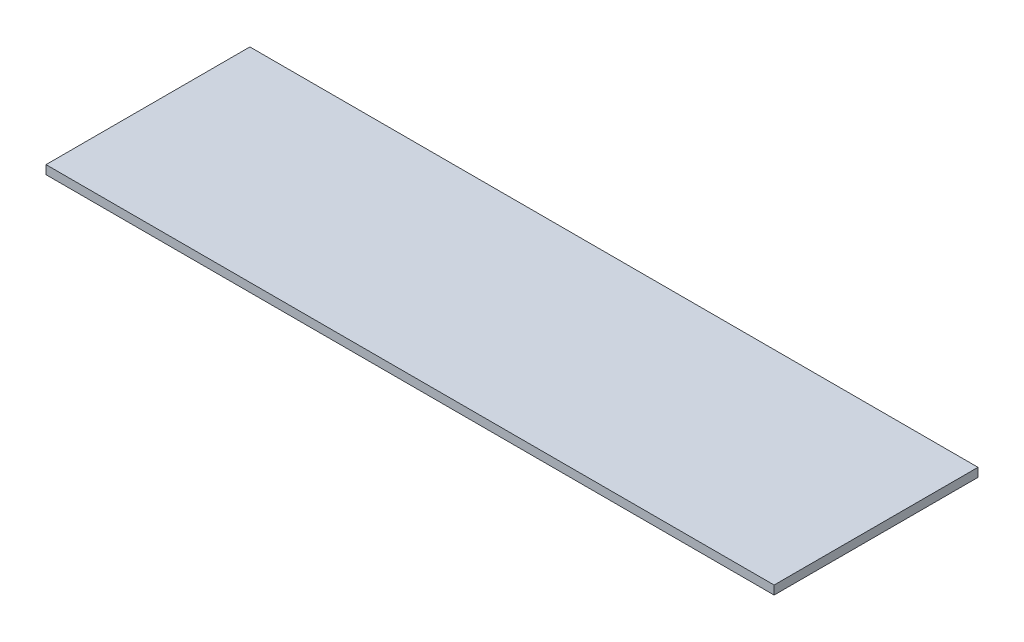
ISO-10303-21;
HEADER;
FILE_DESCRIPTION(('STEP AP214'),'2;1');
FILE_NAME('part.step','',(''),(''),'','','');
FILE_SCHEMA(('AUTOMOTIVE_DESIGN { 1 0 10303 214 1 1 1 1 }'));
ENDSEC;
DATA;
#1=APPLICATION_CONTEXT('core data for automotive mechanical design processes');
#2=APPLICATION_PROTOCOL_DEFINITION('international standard','automotive_design',2000,#1);
#3=PRODUCT_CONTEXT('',#1,'mechanical');
#4=PRODUCT('Part','Part','',(#3));
#5=PRODUCT_RELATED_PRODUCT_CATEGORY('part','',(#4));
#6=PRODUCT_DEFINITION_FORMATION('','',#4);
#7=PRODUCT_DEFINITION_CONTEXT('part definition',#1,'design');
#8=PRODUCT_DEFINITION('design','',#6,#7);
#9=PRODUCT_DEFINITION_SHAPE('','',#8);
#10=(LENGTH_UNIT() NAMED_UNIT(*) SI_UNIT(.MILLI.,.METRE.));
#11=(NAMED_UNIT(*) PLANE_ANGLE_UNIT() SI_UNIT($,.RADIAN.));
#12=(NAMED_UNIT(*) SI_UNIT($,.STERADIAN.) SOLID_ANGLE_UNIT());
#13=UNCERTAINTY_MEASURE_WITH_UNIT(LENGTH_MEASURE(1.E-05),#10,'distance_accuracy_value','');
#14=(GEOMETRIC_REPRESENTATION_CONTEXT(3) GLOBAL_UNCERTAINTY_ASSIGNED_CONTEXT((#13)) GLOBAL_UNIT_ASSIGNED_CONTEXT((#10,
#11,#12)) REPRESENTATION_CONTEXT('',''));
#15=CARTESIAN_POINT('',(0.,0.,0.));
#16=DIRECTION('',(0.,0.,1.));
#17=DIRECTION('',(1.,0.,0.));
#18=AXIS2_PLACEMENT_3D('',#15,#16,#17);
#19=CARTESIAN_POINT('',(125.,3.,35.));
#20=DIRECTION('',(-1.,0.,0.));
#21=DIRECTION('',(0.,0.,1.));
#22=AXIS2_PLACEMENT_3D('',#19,#20,#21);
#23=PLANE('',#22);
#24=DIRECTION('',(0.,0.,-1.));
#25=VECTOR('',#24,1.);
#26=CARTESIAN_POINT('',(125.,0.,35.));
#27=LINE('',#26,#25);
#28=CARTESIAN_POINT('',(125.,0.,35.));
#29=VERTEX_POINT('',#28);
#30=CARTESIAN_POINT('',(125.,0.,-35.));
#31=VERTEX_POINT('',#30);
#32=EDGE_CURVE('E111',#29,#31,#27,.T.);
#33=ORIENTED_EDGE('',*,*,#32,.T.);
#34=DIRECTION('',(0.,-1.,0.));
#35=VECTOR('',#34,1.);
#36=CARTESIAN_POINT('',(125.,3.,-35.));
#37=LINE('',#36,#35);
#38=CARTESIAN_POINT('',(125.,3.,-35.));
#39=VERTEX_POINT('',#38);
#40=EDGE_CURVE('E11',#39,#31,#37,.T.);
#41=ORIENTED_EDGE('',*,*,#40,.F.);
#42=DIRECTION('',(0.,0.,-1.));
#43=VECTOR('',#42,1.);
#44=CARTESIAN_POINT('',(125.,3.,35.));
#45=LINE('',#44,#43);
#46=CARTESIAN_POINT('',(125.,3.,35.));
#47=VERTEX_POINT('',#46);
#48=EDGE_CURVE('E95',#47,#39,#45,.T.);
#49=ORIENTED_EDGE('',*,*,#48,.F.);
#50=DIRECTION('',(0.,-1.,0.));
#51=VECTOR('',#50,1.);
#52=CARTESIAN_POINT('',(125.,3.,35.));
#53=LINE('',#52,#51);
#54=EDGE_CURVE('E107',#47,#29,#53,.T.);
#55=ORIENTED_EDGE('',*,*,#54,.T.);
#56=EDGE_LOOP('',(#33,#41,#49,#55));
#57=FACE_BOUND('',#56,.T.);
#58=ADVANCED_FACE('F43',(#57),#23,.F.);
#59=CARTESIAN_POINT('',(-125.,3.,-35.));
#60=DIRECTION('',(0.,0.,1.));
#61=DIRECTION('',(1.,0.,0.));
#62=AXIS2_PLACEMENT_3D('',#59,#60,#61);
#63=PLANE('',#62);
#64=DIRECTION('',(-1.,0.,0.));
#65=VECTOR('',#64,1.);
#66=CARTESIAN_POINT('',(-125.,0.,-35.));
#67=LINE('',#66,#65);
#68=CARTESIAN_POINT('',(-125.,0.,-35.));
#69=VERTEX_POINT('',#68);
#70=EDGE_CURVE('E100',#31,#69,#67,.T.);
#71=ORIENTED_EDGE('',*,*,#70,.T.);
#72=DIRECTION('',(0.,-1.,0.));
#73=VECTOR('',#72,1.);
#74=CARTESIAN_POINT('',(-125.,3.,-35.));
#75=LINE('',#74,#73);
#76=CARTESIAN_POINT('',(-125.,3.,-35.));
#77=VERTEX_POINT('',#76);
#78=EDGE_CURVE('E52',#77,#69,#75,.T.);
#79=ORIENTED_EDGE('',*,*,#78,.F.);
#80=DIRECTION('',(-1.,0.,0.));
#81=VECTOR('',#80,1.);
#82=CARTESIAN_POINT('',(-125.,3.,-35.));
#83=LINE('',#82,#81);
#84=EDGE_CURVE('E90',#39,#77,#83,.T.);
#85=ORIENTED_EDGE('',*,*,#84,.F.);
#86=ORIENTED_EDGE('',*,*,#40,.T.);
#87=EDGE_LOOP('',(#71,#79,#85,#86));
#88=FACE_BOUND('',#87,.T.);
#89=ADVANCED_FACE('F99',(#88),#63,.F.);
#90=CARTESIAN_POINT('',(-125.,3.,35.));
#91=DIRECTION('',(1.,0.,0.));
#92=DIRECTION('',(0.,0.,-1.));
#93=AXIS2_PLACEMENT_3D('',#90,#91,#92);
#94=PLANE('',#93);
#95=DIRECTION('',(0.,0.,1.));
#96=VECTOR('',#95,1.);
#97=CARTESIAN_POINT('',(-125.,0.,35.));
#98=LINE('',#97,#96);
#99=CARTESIAN_POINT('',(-125.,0.,35.));
#100=VERTEX_POINT('',#99);
#101=EDGE_CURVE('E77',#69,#100,#98,.T.);
#102=ORIENTED_EDGE('',*,*,#101,.T.);
#103=DIRECTION('',(0.,-1.,0.));
#104=VECTOR('',#103,1.);
#105=CARTESIAN_POINT('',(-125.,3.,35.));
#106=LINE('',#105,#104);
#107=CARTESIAN_POINT('',(-125.,3.,35.));
#108=VERTEX_POINT('',#107);
#109=EDGE_CURVE('E102',#108,#100,#106,.T.);
#110=ORIENTED_EDGE('',*,*,#109,.F.);
#111=DIRECTION('',(0.,0.,1.));
#112=VECTOR('',#111,1.);
#113=CARTESIAN_POINT('',(-125.,3.,35.));
#114=LINE('',#113,#112);
#115=EDGE_CURVE('E93',#77,#108,#114,.T.);
#116=ORIENTED_EDGE('',*,*,#115,.F.);
#117=ORIENTED_EDGE('',*,*,#78,.T.);
#118=EDGE_LOOP('',(#102,#110,#116,#117));
#119=FACE_BOUND('',#118,.T.);
#120=ADVANCED_FACE('F103',(#119),#94,.F.);
#121=CARTESIAN_POINT('',(-125.,3.,35.));
#122=DIRECTION('',(0.,0.,-1.));
#123=DIRECTION('',(-1.,0.,0.));
#124=AXIS2_PLACEMENT_3D('',#121,#122,#123);
#125=PLANE('',#124);
#126=DIRECTION('',(1.,0.,0.));
#127=VECTOR('',#126,1.);
#128=CARTESIAN_POINT('',(-125.,0.,35.));
#129=LINE('',#128,#127);
#130=EDGE_CURVE('E83',#100,#29,#129,.T.);
#131=ORIENTED_EDGE('',*,*,#130,.T.);
#132=ORIENTED_EDGE('',*,*,#54,.F.);
#133=DIRECTION('',(1.,0.,0.));
#134=VECTOR('',#133,1.);
#135=CARTESIAN_POINT('',(-125.,3.,35.));
#136=LINE('',#135,#134);
#137=EDGE_CURVE('E60',#108,#47,#136,.T.);
#138=ORIENTED_EDGE('',*,*,#137,.F.);
#139=ORIENTED_EDGE('',*,*,#109,.T.);
#140=EDGE_LOOP('',(#131,#132,#138,#139));
#141=FACE_BOUND('',#140,.T.);
#142=ADVANCED_FACE('F124',(#141),#125,.F.);
#143=CARTESIAN_POINT('',(0.,3.,0.));
#144=DIRECTION('',(0.,-1.,0.));
#145=DIRECTION('',(0.,0.,-1.));
#146=AXIS2_PLACEMENT_3D('',#143,#144,#145);
#147=PLANE('',#146);
#148=ORIENTED_EDGE('',*,*,#48,.T.);
#149=ORIENTED_EDGE('',*,*,#84,.T.);
#150=ORIENTED_EDGE('',*,*,#115,.T.);
#151=ORIENTED_EDGE('',*,*,#137,.T.);
#152=EDGE_LOOP('',(#148,#149,#150,#151));
#153=FACE_BOUND('',#152,.T.);
#154=ADVANCED_FACE('F91',(#153),#147,.F.);
#155=CARTESIAN_POINT('',(0.,0.,0.));
#156=DIRECTION('',(0.,-1.,0.));
#157=DIRECTION('',(0.,0.,-1.));
#158=AXIS2_PLACEMENT_3D('',#155,#156,#157);
#159=PLANE('',#158);
#160=ORIENTED_EDGE('',*,*,#32,.F.);
#161=ORIENTED_EDGE('',*,*,#130,.F.);
#162=ORIENTED_EDGE('',*,*,#101,.F.);
#163=ORIENTED_EDGE('',*,*,#70,.F.);
#164=EDGE_LOOP('',(#160,#161,#162,#163));
#165=FACE_BOUND('',#164,.T.);
#166=ADVANCED_FACE('F127',(#165),#159,.T.);
#167=CLOSED_SHELL('',(#58,#89,#120,#142,#154,#166));
#168=MANIFOLD_SOLID_BREP('B2',#167);
#169=ADVANCED_BREP_SHAPE_REPRESENTATION('',(#18,#168),#14);
#170=SHAPE_DEFINITION_REPRESENTATION(#9,#169);
ENDSEC;
END-ISO-10303-21;
